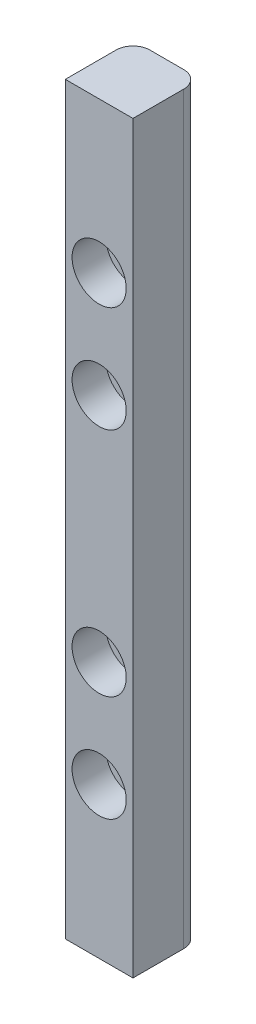
ISO-10303-21;
HEADER;
FILE_DESCRIPTION(('STEP AP214'),'2;1');
FILE_NAME('part.step','',(''),(''),'','','');
FILE_SCHEMA(('AUTOMOTIVE_DESIGN { 1 0 10303 214 1 1 1 1 }'));
ENDSEC;
DATA;
#1=APPLICATION_CONTEXT('core data for automotive mechanical design processes');
#2=APPLICATION_PROTOCOL_DEFINITION('international standard','automotive_design',2000,#1);
#3=PRODUCT_CONTEXT('',#1,'mechanical');
#4=PRODUCT('Part','Part','',(#3));
#5=PRODUCT_RELATED_PRODUCT_CATEGORY('part','',(#4));
#6=PRODUCT_DEFINITION_FORMATION('','',#4);
#7=PRODUCT_DEFINITION_CONTEXT('part definition',#1,'design');
#8=PRODUCT_DEFINITION('design','',#6,#7);
#9=PRODUCT_DEFINITION_SHAPE('','',#8);
#10=(LENGTH_UNIT() NAMED_UNIT(*) SI_UNIT(.MILLI.,.METRE.));
#11=(NAMED_UNIT(*) PLANE_ANGLE_UNIT() SI_UNIT($,.RADIAN.));
#12=(NAMED_UNIT(*) SI_UNIT($,.STERADIAN.) SOLID_ANGLE_UNIT());
#13=UNCERTAINTY_MEASURE_WITH_UNIT(LENGTH_MEASURE(1.E-05),#10,'distance_accuracy_value','');
#14=(GEOMETRIC_REPRESENTATION_CONTEXT(3) GLOBAL_UNCERTAINTY_ASSIGNED_CONTEXT((#13)) GLOBAL_UNIT_ASSIGNED_CONTEXT((#10,
#11,#12)) REPRESENTATION_CONTEXT('',''));
#15=CARTESIAN_POINT('',(0.,0.,0.));
#16=DIRECTION('',(0.,0.,1.));
#17=DIRECTION('',(1.,0.,0.));
#18=AXIS2_PLACEMENT_3D('',#15,#16,#17);
#19=CARTESIAN_POINT('',(10.,0.,10.));
#20=DIRECTION('',(0.,1.,0.));
#21=DIRECTION('',(0.,0.,1.));
#22=AXIS2_PLACEMENT_3D('',#19,#20,#21);
#23=PLANE('',#22);
#24=DIRECTION('',(0.,0.,-1.));
#25=VECTOR('',#24,1.);
#26=CARTESIAN_POINT('',(0.,0.,10.));
#27=LINE('',#26,#25);
#28=CARTESIAN_POINT('',(0.,0.,10.));
#29=VERTEX_POINT('',#28);
#30=CARTESIAN_POINT('',(0.,0.,2.5));
#31=VERTEX_POINT('',#30);
#32=EDGE_CURVE('E141',#29,#31,#27,.T.);
#33=ORIENTED_EDGE('',*,*,#32,.T.);
#34=CARTESIAN_POINT('',(2.5,0.,2.5));
#35=DIRECTION('',(0.,1.,0.));
#36=DIRECTION('',(0.,0.,1.));
#37=AXIS2_PLACEMENT_3D('',#34,#35,#36);
#38=CIRCLE('',#37,2.5);
#39=CARTESIAN_POINT('',(2.5,0.,0.));
#40=VERTEX_POINT('',#39);
#41=EDGE_CURVE('E127',#31,#40,#38,.F.);
#42=ORIENTED_EDGE('',*,*,#41,.T.);
#43=DIRECTION('',(1.,0.,0.));
#44=VECTOR('',#43,1.);
#45=CARTESIAN_POINT('',(10.,0.,0.));
#46=LINE('',#45,#44);
#47=CARTESIAN_POINT('',(7.5,0.,0.));
#48=VERTEX_POINT('',#47);
#49=EDGE_CURVE('E143',#40,#48,#46,.T.);
#50=ORIENTED_EDGE('',*,*,#49,.T.);
#51=CARTESIAN_POINT('',(7.5,0.,2.5));
#52=DIRECTION('',(0.,1.,0.));
#53=DIRECTION('',(0.,0.,1.));
#54=AXIS2_PLACEMENT_3D('',#51,#52,#53);
#55=CIRCLE('',#54,2.5);
#56=CARTESIAN_POINT('',(10.,0.,2.5));
#57=VERTEX_POINT('',#56);
#58=EDGE_CURVE('E117',#48,#57,#55,.F.);
#59=ORIENTED_EDGE('',*,*,#58,.T.);
#60=DIRECTION('',(0.,0.,-1.));
#61=VECTOR('',#60,1.);
#62=CARTESIAN_POINT('',(10.,0.,10.));
#63=LINE('',#62,#61);
#64=CARTESIAN_POINT('',(10.,0.,10.));
#65=VERTEX_POINT('',#64);
#66=EDGE_CURVE('E98',#65,#57,#63,.T.);
#67=ORIENTED_EDGE('',*,*,#66,.F.);
#68=DIRECTION('',(1.,0.,0.));
#69=VECTOR('',#68,1.);
#70=CARTESIAN_POINT('',(10.,0.,10.));
#71=LINE('',#70,#69);
#72=EDGE_CURVE('E104',#29,#65,#71,.T.);
#73=ORIENTED_EDGE('',*,*,#72,.F.);
#74=EDGE_LOOP('',(#33,#42,#50,#59,#67,#73));
#75=FACE_BOUND('',#74,.T.);
#76=ADVANCED_FACE('F39',(#75),#23,.F.);
#77=CARTESIAN_POINT('',(10.,110.,10.));
#78=DIRECTION('',(-1.,0.,0.));
#79=DIRECTION('',(0.,0.,1.));
#80=AXIS2_PLACEMENT_3D('',#77,#78,#79);
#81=PLANE('',#80);
#82=ORIENTED_EDGE('',*,*,#66,.T.);
#83=DIRECTION('',(0.,1.,0.));
#84=VECTOR('',#83,1.);
#85=CARTESIAN_POINT('',(10.,110.,2.5));
#86=LINE('',#85,#84);
#87=CARTESIAN_POINT('',(10.,110.,2.5));
#88=VERTEX_POINT('',#87);
#89=EDGE_CURVE('E11',#57,#88,#86,.T.);
#90=ORIENTED_EDGE('',*,*,#89,.T.);
#91=DIRECTION('',(0.,0.,-1.));
#92=VECTOR('',#91,1.);
#93=CARTESIAN_POINT('',(10.,110.,10.));
#94=LINE('',#93,#92);
#95=CARTESIAN_POINT('',(10.,110.,10.));
#96=VERTEX_POINT('',#95);
#97=EDGE_CURVE('E100',#96,#88,#94,.T.);
#98=ORIENTED_EDGE('',*,*,#97,.F.);
#99=DIRECTION('',(0.,1.,0.));
#100=VECTOR('',#99,1.);
#101=CARTESIAN_POINT('',(10.,110.,10.));
#102=LINE('',#101,#100);
#103=EDGE_CURVE('E94',#65,#96,#102,.T.);
#104=ORIENTED_EDGE('',*,*,#103,.F.);
#105=EDGE_LOOP('',(#82,#90,#98,#104));
#106=FACE_BOUND('',#105,.T.);
#107=ADVANCED_FACE('F96',(#106),#81,.F.);
#108=CARTESIAN_POINT('',(0.,110.,10.));
#109=DIRECTION('',(0.,-1.,0.));
#110=DIRECTION('',(0.,0.,-1.));
#111=AXIS2_PLACEMENT_3D('',#108,#109,#110);
#112=PLANE('',#111);
#113=DIRECTION('',(-1.,0.,0.));
#114=VECTOR('',#113,1.);
#115=CARTESIAN_POINT('',(0.,110.,0.));
#116=LINE('',#115,#114);
#117=CARTESIAN_POINT('',(7.5,110.,0.));
#118=VERTEX_POINT('',#117);
#119=CARTESIAN_POINT('',(2.5,110.,0.));
#120=VERTEX_POINT('',#119);
#121=EDGE_CURVE('E113',#118,#120,#116,.T.);
#122=ORIENTED_EDGE('',*,*,#121,.T.);
#123=CARTESIAN_POINT('',(2.5,110.,2.5));
#124=DIRECTION('',(0.,-1.,0.));
#125=DIRECTION('',(0.,0.,-1.));
#126=AXIS2_PLACEMENT_3D('',#123,#124,#125);
#127=CIRCLE('',#126,2.5);
#128=CARTESIAN_POINT('',(0.,110.,2.5));
#129=VERTEX_POINT('',#128);
#130=EDGE_CURVE('E47',#120,#129,#127,.F.);
#131=ORIENTED_EDGE('',*,*,#130,.T.);
#132=DIRECTION('',(0.,0.,-1.));
#133=VECTOR('',#132,1.);
#134=CARTESIAN_POINT('',(0.,110.,10.));
#135=LINE('',#134,#133);
#136=CARTESIAN_POINT('',(0.,110.,10.));
#137=VERTEX_POINT('',#136);
#138=EDGE_CURVE('E122',#137,#129,#135,.T.);
#139=ORIENTED_EDGE('',*,*,#138,.F.);
#140=DIRECTION('',(-1.,0.,0.));
#141=VECTOR('',#140,1.);
#142=CARTESIAN_POINT('',(0.,110.,10.));
#143=LINE('',#142,#141);
#144=EDGE_CURVE('E103',#96,#137,#143,.T.);
#145=ORIENTED_EDGE('',*,*,#144,.F.);
#146=ORIENTED_EDGE('',*,*,#97,.T.);
#147=CARTESIAN_POINT('',(7.5,110.,2.5));
#148=DIRECTION('',(0.,-1.,0.));
#149=DIRECTION('',(0.,0.,-1.));
#150=AXIS2_PLACEMENT_3D('',#147,#148,#149);
#151=CIRCLE('',#150,2.5);
#152=EDGE_CURVE('E54',#88,#118,#151,.F.);
#153=ORIENTED_EDGE('',*,*,#152,.T.);
#154=EDGE_LOOP('',(#122,#131,#139,#145,#146,#153));
#155=FACE_BOUND('',#154,.T.);
#156=ADVANCED_FACE('F136',(#155),#112,.F.);
#157=CARTESIAN_POINT('',(0.,0.,10.));
#158=DIRECTION('',(1.,0.,0.));
#159=DIRECTION('',(0.,0.,-1.));
#160=AXIS2_PLACEMENT_3D('',#157,#158,#159);
#161=PLANE('',#160);
#162=ORIENTED_EDGE('',*,*,#138,.T.);
#163=DIRECTION('',(0.,-1.,0.));
#164=VECTOR('',#163,1.);
#165=CARTESIAN_POINT('',(0.,0.,2.5));
#166=LINE('',#165,#164);
#167=EDGE_CURVE('E118',#129,#31,#166,.T.);
#168=ORIENTED_EDGE('',*,*,#167,.T.);
#169=ORIENTED_EDGE('',*,*,#32,.F.);
#170=DIRECTION('',(0.,-1.,0.));
#171=VECTOR('',#170,1.);
#172=CARTESIAN_POINT('',(0.,0.,10.));
#173=LINE('',#172,#171);
#174=EDGE_CURVE('E109',#137,#29,#173,.T.);
#175=ORIENTED_EDGE('',*,*,#174,.F.);
#176=EDGE_LOOP('',(#162,#168,#169,#175));
#177=FACE_BOUND('',#176,.T.);
#178=ADVANCED_FACE('F140',(#177),#161,.F.);
#179=CARTESIAN_POINT('',(0.,0.,10.));
#180=DIRECTION('',(0.,0.,-1.));
#181=DIRECTION('',(-1.,0.,0.));
#182=AXIS2_PLACEMENT_3D('',#179,#180,#181);
#183=PLANE('',#182);
#184=CARTESIAN_POINT('',(5.,87.7318956510383,10.));
#185=DIRECTION('',(0.,0.,1.));
#186=DIRECTION('',(1.,0.,0.));
#187=AXIS2_PLACEMENT_3D('',#184,#185,#186);
#188=CIRCLE('',#187,4.);
#189=CARTESIAN_POINT('',(9.,87.7318956510383,10.));
#190=VERTEX_POINT('',#189);
#191=EDGE_CURVE('E149',#190,#190,#188,.T.);
#192=ORIENTED_EDGE('',*,*,#191,.F.);
#193=EDGE_LOOP('',(#192));
#194=FACE_BOUND('',#193,.T.);
#195=CARTESIAN_POINT('',(5.,72.0775107744548,10.));
#196=DIRECTION('',(0.,0.,1.));
#197=DIRECTION('',(1.,0.,0.));
#198=AXIS2_PLACEMENT_3D('',#195,#196,#197);
#199=CIRCLE('',#198,4.);
#200=CARTESIAN_POINT('',(9.,72.0775107744548,10.));
#201=VERTEX_POINT('',#200);
#202=EDGE_CURVE('E170',#201,#201,#199,.T.);
#203=ORIENTED_EDGE('',*,*,#202,.F.);
#204=EDGE_LOOP('',(#203));
#205=FACE_BOUND('',#204,.T.);
#206=CARTESIAN_POINT('',(5.,37.9224892255452,10.));
#207=DIRECTION('',(0.,0.,1.));
#208=DIRECTION('',(-1.,0.,0.));
#209=AXIS2_PLACEMENT_3D('',#206,#207,#208);
#210=CIRCLE('',#209,4.);
#211=CARTESIAN_POINT('',(0.999999999999997,37.9224892255452,10.));
#212=VERTEX_POINT('',#211);
#213=EDGE_CURVE('E164',#212,#212,#210,.T.);
#214=ORIENTED_EDGE('',*,*,#213,.F.);
#215=EDGE_LOOP('',(#214));
#216=FACE_BOUND('',#215,.T.);
#217=CARTESIAN_POINT('',(5.,22.2681043489617,10.));
#218=DIRECTION('',(0.,0.,1.));
#219=DIRECTION('',(-1.,0.,0.));
#220=AXIS2_PLACEMENT_3D('',#217,#218,#219);
#221=CIRCLE('',#220,4.);
#222=CARTESIAN_POINT('',(0.999999999999997,22.2681043489617,10.));
#223=VERTEX_POINT('',#222);
#224=EDGE_CURVE('E158',#223,#223,#221,.T.);
#225=ORIENTED_EDGE('',*,*,#224,.F.);
#226=EDGE_LOOP('',(#225));
#227=FACE_BOUND('',#226,.T.);
#228=ORIENTED_EDGE('',*,*,#72,.T.);
#229=ORIENTED_EDGE('',*,*,#103,.T.);
#230=ORIENTED_EDGE('',*,*,#144,.T.);
#231=ORIENTED_EDGE('',*,*,#174,.T.);
#232=EDGE_LOOP('',(#228,#229,#230,#231));
#233=FACE_BOUND('',#232,.T.);
#234=ADVANCED_FACE('F107',(#194,#205,#216,#227,#233),#183,.F.);
#235=CARTESIAN_POINT('',(0.,0.,0.));
#236=DIRECTION('',(0.,0.,-1.));
#237=DIRECTION('',(-1.,0.,0.));
#238=AXIS2_PLACEMENT_3D('',#235,#236,#237);
#239=PLANE('',#238);
#240=ORIENTED_EDGE('',*,*,#49,.F.);
#241=DIRECTION('',(0.,-1.,0.));
#242=VECTOR('',#241,1.);
#243=CARTESIAN_POINT('',(2.5,110.,0.));
#244=LINE('',#243,#242);
#245=EDGE_CURVE('E61',#40,#120,#244,.F.);
#246=ORIENTED_EDGE('',*,*,#245,.T.);
#247=ORIENTED_EDGE('',*,*,#121,.F.);
#248=DIRECTION('',(0.,1.,0.));
#249=VECTOR('',#248,1.);
#250=CARTESIAN_POINT('',(7.5,0.,0.));
#251=LINE('',#250,#249);
#252=EDGE_CURVE('E129',#118,#48,#251,.F.);
#253=ORIENTED_EDGE('',*,*,#252,.T.);
#254=EDGE_LOOP('',(#240,#246,#247,#253));
#255=FACE_BOUND('',#254,.T.);
#256=ADVANCED_FACE('F144',(#255),#239,.T.);
#257=CARTESIAN_POINT('',(5.,22.2681043489617,5.));
#258=DIRECTION('',(0.,0.,1.));
#259=DIRECTION('',(1.,0.,0.));
#260=AXIS2_PLACEMENT_3D('',#257,#258,#259);
#261=CYLINDRICAL_SURFACE('',#260,4.);
#262=CARTESIAN_POINT('',(5.,22.2681043489617,5.));
#263=DIRECTION('',(0.,0.,1.));
#264=DIRECTION('',(-1.,0.,0.));
#265=AXIS2_PLACEMENT_3D('',#262,#263,#264);
#266=CIRCLE('',#265,4.);
#267=CARTESIAN_POINT('',(0.999999999999997,22.2681043489617,5.));
#268=VERTEX_POINT('',#267);
#269=EDGE_CURVE('E155',#268,#268,#266,.T.);
#270=ORIENTED_EDGE('',*,*,#269,.F.);
#271=EDGE_LOOP('',(#270));
#272=FACE_BOUND('',#271,.T.);
#273=ORIENTED_EDGE('',*,*,#224,.T.);
#274=EDGE_LOOP('',(#273));
#275=FACE_BOUND('',#274,.T.);
#276=ADVANCED_FACE('F187',(#272,#275),#261,.F.);
#277=CARTESIAN_POINT('',(5.,22.2681043489617,5.));
#278=DIRECTION('',(0.,0.,-1.));
#279=DIRECTION('',(-1.,0.,0.));
#280=AXIS2_PLACEMENT_3D('',#277,#278,#279);
#281=PLANE('',#280);
#282=ORIENTED_EDGE('',*,*,#269,.T.);
#283=EDGE_LOOP('',(#282));
#284=FACE_BOUND('',#283,.T.);
#285=ADVANCED_FACE('F189',(#284),#281,.F.);
#286=CARTESIAN_POINT('',(5.,37.9224892255452,5.));
#287=DIRECTION('',(0.,0.,1.));
#288=DIRECTION('',(1.,0.,0.));
#289=AXIS2_PLACEMENT_3D('',#286,#287,#288);
#290=CYLINDRICAL_SURFACE('',#289,4.);
#291=CARTESIAN_POINT('',(5.,37.9224892255452,5.));
#292=DIRECTION('',(0.,0.,1.));
#293=DIRECTION('',(-1.,0.,0.));
#294=AXIS2_PLACEMENT_3D('',#291,#292,#293);
#295=CIRCLE('',#294,4.);
#296=CARTESIAN_POINT('',(0.999999999999997,37.9224892255452,5.));
#297=VERTEX_POINT('',#296);
#298=EDGE_CURVE('E161',#297,#297,#295,.T.);
#299=ORIENTED_EDGE('',*,*,#298,.F.);
#300=EDGE_LOOP('',(#299));
#301=FACE_BOUND('',#300,.T.);
#302=ORIENTED_EDGE('',*,*,#213,.T.);
#303=EDGE_LOOP('',(#302));
#304=FACE_BOUND('',#303,.T.);
#305=ADVANCED_FACE('F195',(#301,#304),#290,.F.);
#306=CARTESIAN_POINT('',(5.,37.9224892255452,5.));
#307=DIRECTION('',(0.,0.,-1.));
#308=DIRECTION('',(-1.,0.,0.));
#309=AXIS2_PLACEMENT_3D('',#306,#307,#308);
#310=PLANE('',#309);
#311=ORIENTED_EDGE('',*,*,#298,.T.);
#312=EDGE_LOOP('',(#311));
#313=FACE_BOUND('',#312,.T.);
#314=ADVANCED_FACE('F227',(#313),#310,.F.);
#315=CARTESIAN_POINT('',(5.,72.0775107744548,5.));
#316=DIRECTION('',(0.,0.,1.));
#317=DIRECTION('',(1.,0.,0.));
#318=AXIS2_PLACEMENT_3D('',#315,#316,#317);
#319=CYLINDRICAL_SURFACE('',#318,4.);
#320=CARTESIAN_POINT('',(5.,72.0775107744548,5.));
#321=DIRECTION('',(0.,0.,1.));
#322=DIRECTION('',(1.,0.,0.));
#323=AXIS2_PLACEMENT_3D('',#320,#321,#322);
#324=CIRCLE('',#323,4.);
#325=CARTESIAN_POINT('',(9.,72.0775107744548,5.));
#326=VERTEX_POINT('',#325);
#327=EDGE_CURVE('E167',#326,#326,#324,.T.);
#328=ORIENTED_EDGE('',*,*,#327,.F.);
#329=EDGE_LOOP('',(#328));
#330=FACE_BOUND('',#329,.T.);
#331=ORIENTED_EDGE('',*,*,#202,.T.);
#332=EDGE_LOOP('',(#331));
#333=FACE_BOUND('',#332,.T.);
#334=ADVANCED_FACE('F224',(#330,#333),#319,.F.);
#335=CARTESIAN_POINT('',(5.,72.0775107744548,5.));
#336=DIRECTION('',(0.,0.,1.));
#337=DIRECTION('',(1.,0.,0.));
#338=AXIS2_PLACEMENT_3D('',#335,#336,#337);
#339=PLANE('',#338);
#340=ORIENTED_EDGE('',*,*,#327,.T.);
#341=EDGE_LOOP('',(#340));
#342=FACE_BOUND('',#341,.T.);
#343=ADVANCED_FACE('F220',(#342),#339,.T.);
#344=CARTESIAN_POINT('',(5.,87.7318956510383,5.));
#345=DIRECTION('',(0.,0.,1.));
#346=DIRECTION('',(1.,0.,0.));
#347=AXIS2_PLACEMENT_3D('',#344,#345,#346);
#348=CYLINDRICAL_SURFACE('',#347,4.);
#349=CARTESIAN_POINT('',(5.,87.7318956510383,5.));
#350=DIRECTION('',(0.,0.,1.));
#351=DIRECTION('',(1.,0.,0.));
#352=AXIS2_PLACEMENT_3D('',#349,#350,#351);
#353=CIRCLE('',#352,4.);
#354=CARTESIAN_POINT('',(9.,87.7318956510383,5.));
#355=VERTEX_POINT('',#354);
#356=EDGE_CURVE('E145',#355,#355,#353,.T.);
#357=ORIENTED_EDGE('',*,*,#356,.F.);
#358=EDGE_LOOP('',(#357));
#359=FACE_BOUND('',#358,.T.);
#360=ORIENTED_EDGE('',*,*,#191,.T.);
#361=EDGE_LOOP('',(#360));
#362=FACE_BOUND('',#361,.T.);
#363=ADVANCED_FACE('F176',(#359,#362),#348,.F.);
#364=CARTESIAN_POINT('',(5.,87.7318956510383,5.));
#365=DIRECTION('',(0.,0.,1.));
#366=DIRECTION('',(1.,0.,0.));
#367=AXIS2_PLACEMENT_3D('',#364,#365,#366);
#368=PLANE('',#367);
#369=ORIENTED_EDGE('',*,*,#356,.T.);
#370=EDGE_LOOP('',(#369));
#371=FACE_BOUND('',#370,.T.);
#372=ADVANCED_FACE('F211',(#371),#368,.T.);
#373=CARTESIAN_POINT('',(2.5,0.,2.5));
#374=DIRECTION('',(0.,1.,0.));
#375=DIRECTION('',(0.,0.,1.));
#376=AXIS2_PLACEMENT_3D('',#373,#374,#375);
#377=CYLINDRICAL_SURFACE('',#376,2.5);
#378=ORIENTED_EDGE('',*,*,#130,.F.);
#379=ORIENTED_EDGE('',*,*,#245,.F.);
#380=ORIENTED_EDGE('',*,*,#41,.F.);
#381=ORIENTED_EDGE('',*,*,#167,.F.);
#382=EDGE_LOOP('',(#378,#379,#380,#381));
#383=FACE_BOUND('',#382,.T.);
#384=ADVANCED_FACE('F142',(#383),#377,.T.);
#385=CARTESIAN_POINT('',(7.5,110.,2.5));
#386=DIRECTION('',(0.,-1.,0.));
#387=DIRECTION('',(0.,0.,-1.));
#388=AXIS2_PLACEMENT_3D('',#385,#386,#387);
#389=CYLINDRICAL_SURFACE('',#388,2.5);
#390=ORIENTED_EDGE('',*,*,#58,.F.);
#391=ORIENTED_EDGE('',*,*,#252,.F.);
#392=ORIENTED_EDGE('',*,*,#152,.F.);
#393=ORIENTED_EDGE('',*,*,#89,.F.);
#394=EDGE_LOOP('',(#390,#391,#392,#393));
#395=FACE_BOUND('',#394,.T.);
#396=ADVANCED_FACE('F41',(#395),#389,.T.);
#397=CLOSED_SHELL('',(#76,#107,#156,#178,#234,#256,#276,#285,#305,#314,#334,#343,#363,#372,#384,#396));
#398=MANIFOLD_SOLID_BREP('B2',#397);
#399=ADVANCED_BREP_SHAPE_REPRESENTATION('',(#18,#398),#14);
#400=SHAPE_DEFINITION_REPRESENTATION(#9,#399);
ENDSEC;
END-ISO-10303-21;
